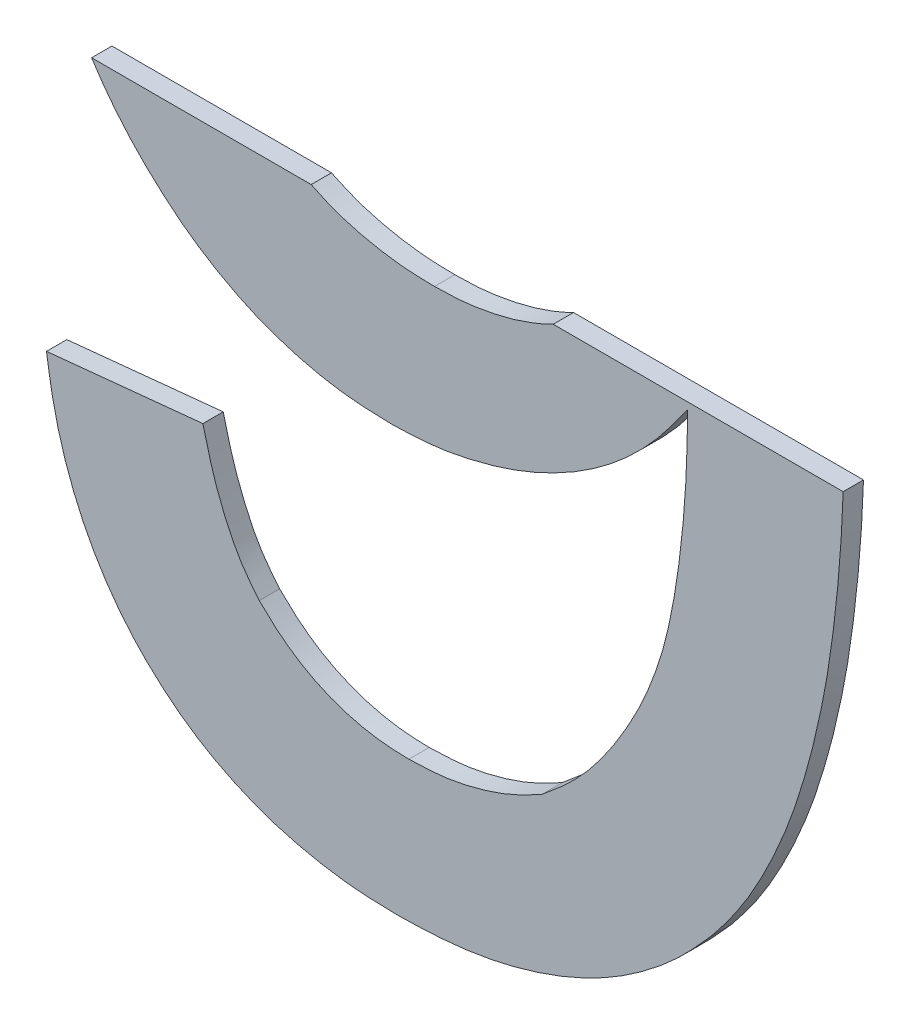
ISO-10303-21;
HEADER;
FILE_DESCRIPTION(('STEP AP214'),'2;1');
FILE_NAME('part.step','',(''),(''),'','','');
FILE_SCHEMA(('AUTOMOTIVE_DESIGN { 1 0 10303 214 1 1 1 1 }'));
ENDSEC;
DATA;
#1=APPLICATION_CONTEXT('core data for automotive mechanical design processes');
#2=APPLICATION_PROTOCOL_DEFINITION('international standard','automotive_design',2000,#1);
#3=PRODUCT_CONTEXT('',#1,'mechanical');
#4=PRODUCT('Part','Part','',(#3));
#5=PRODUCT_RELATED_PRODUCT_CATEGORY('part','',(#4));
#6=PRODUCT_DEFINITION_FORMATION('','',#4);
#7=PRODUCT_DEFINITION_CONTEXT('part definition',#1,'design');
#8=PRODUCT_DEFINITION('design','',#6,#7);
#9=PRODUCT_DEFINITION_SHAPE('','',#8);
#10=(LENGTH_UNIT() NAMED_UNIT(*) SI_UNIT(.MILLI.,.METRE.));
#11=(NAMED_UNIT(*) PLANE_ANGLE_UNIT() SI_UNIT($,.RADIAN.));
#12=(NAMED_UNIT(*) SI_UNIT($,.STERADIAN.) SOLID_ANGLE_UNIT());
#13=UNCERTAINTY_MEASURE_WITH_UNIT(LENGTH_MEASURE(1.E-05),#10,'distance_accuracy_value','');
#14=(GEOMETRIC_REPRESENTATION_CONTEXT(3) GLOBAL_UNCERTAINTY_ASSIGNED_CONTEXT((#13)) GLOBAL_UNIT_ASSIGNED_CONTEXT((#10,
#11,#12)) REPRESENTATION_CONTEXT('',''));
#15=CARTESIAN_POINT('',(0.,0.,0.));
#16=DIRECTION('',(0.,0.,1.));
#17=DIRECTION('',(1.,0.,0.));
#18=AXIS2_PLACEMENT_3D('',#15,#16,#17);
#19=CARTESIAN_POINT('',(6.53846153846051,-0.66105769230769,0.5));
#20=CARTESIAN_POINT('',(6.31163091214394,-0.97955265413839,0.5));
#21=CARTESIAN_POINT('',(5.86759612348959,-1.60302597147871,0.5));
#22=CARTESIAN_POINT('',(5.08450026442372,-2.42121954868309,0.5));
#23=CARTESIAN_POINT('',(4.22420168369231,-3.10691477412572,0.5));
#24=CARTESIAN_POINT('',(3.29574981173123,-3.65898288511663,0.5));
#25=CARTESIAN_POINT('',(2.32171004358858,-4.0870100622762,0.5));
#26=CARTESIAN_POINT('',(1.3173782510081,-4.3842189265121,0.5));
#27=CARTESIAN_POINT('',(0.292336320810029,-4.58384585004598,0.5));
#28=CARTESIAN_POINT('',(-0.401706530398715,-4.60482184661097,0.5));
#29=CARTESIAN_POINT('',(-0.751201923077954,-4.61538461538461,0.5));
#30=B_SPLINE_CURVE_WITH_KNOTS('',3,(#19,#20,#21,#22,#23,#24,#25,#26,#27,#28,#29),.UNSPECIFIED.,
.F.,.F.,(4,1,1,1,1,1,1,1,4),(0.,0.135516809987238,0.265282422655817,0.391399589415771,
0.516066609454906,0.638987766132838,0.759470315827824,0.878877772064992,1.),.UNSPECIFIED.);
#31=DIRECTION('',(0.,0.,1.));
#32=VECTOR('',#31,1.);
#33=SURFACE_OF_LINEAR_EXTRUSION('',#30,#32);
#34=CARTESIAN_POINT('',(6.53846153846051,-0.66105769230769,1.));
#35=CARTESIAN_POINT('',(6.31163091214394,-0.97955265413839,1.));
#36=CARTESIAN_POINT('',(5.86759612348959,-1.60302597147871,1.));
#37=CARTESIAN_POINT('',(5.08450026442372,-2.42121954868309,1.));
#38=CARTESIAN_POINT('',(4.22420168369231,-3.10691477412572,1.));
#39=CARTESIAN_POINT('',(3.29574981173123,-3.65898288511663,1.));
#40=CARTESIAN_POINT('',(2.32171004358858,-4.0870100622762,1.));
#41=CARTESIAN_POINT('',(1.3173782510081,-4.3842189265121,1.));
#42=CARTESIAN_POINT('',(0.292336320810029,-4.58384585004598,1.));
#43=CARTESIAN_POINT('',(-0.401706530398715,-4.60482184661097,1.));
#44=CARTESIAN_POINT('',(-0.751201923077954,-4.61538461538461,1.));
#45=B_SPLINE_CURVE_WITH_KNOTS('',3,(#34,#35,#36,#37,#38,#39,#40,#41,#42,#43,#44),.UNSPECIFIED.,
.F.,.F.,(4,1,1,1,1,1,1,1,4),(0.,0.135516809987238,0.265282422655817,0.391399589415771,
0.516066609454906,0.638987766132838,0.759470315827824,0.878877772064992,1.),.UNSPECIFIED.);
#46=CARTESIAN_POINT('',(6.53846153846051,-0.66105769230769,1.));
#47=VERTEX_POINT('',#46);
#48=CARTESIAN_POINT('',(-0.751201923077954,-4.61538461538461,1.));
#49=VERTEX_POINT('',#48);
#50=EDGE_CURVE('E167',#47,#49,#45,.T.);
#51=ORIENTED_EDGE('',*,*,#50,.T.);
#52=DIRECTION('',(0.,0.,1.));
#53=VECTOR('',#52,1.);
#54=CARTESIAN_POINT('',(-0.751201923077954,-4.61538461538461,0.5));
#55=LINE('',#54,#53);
#56=CARTESIAN_POINT('',(-0.751201923077954,-4.61538461538461,0.5));
#57=VERTEX_POINT('',#56);
#58=EDGE_CURVE('E188',#57,#49,#55,.T.);
#59=ORIENTED_EDGE('',*,*,#58,.F.);
#60=CARTESIAN_POINT('',(6.53846153846051,-0.66105769230769,0.5));
#61=VERTEX_POINT('',#60);
#62=EDGE_CURVE('E333',#61,#57,#30,.T.);
#63=ORIENTED_EDGE('',*,*,#62,.F.);
#64=DIRECTION('',(0.,0.,1.));
#65=VECTOR('',#64,1.);
#66=CARTESIAN_POINT('',(6.53846153846051,-0.66105769230769,0.5));
#67=LINE('',#66,#65);
#68=EDGE_CURVE('E195',#61,#47,#67,.T.);
#69=ORIENTED_EDGE('',*,*,#68,.T.);
#70=EDGE_LOOP('',(#51,#59,#63,#69));
#71=FACE_BOUND('',#70,.T.);
#72=ADVANCED_FACE('F39',(#71),#33,.F.);
#73=CARTESIAN_POINT('',(2.95673076922974,-10.6490384615385,0.5));
#74=CARTESIAN_POINT('',(3.20735992951563,-10.4413061263277,0.5));
#75=CARTESIAN_POINT('',(3.72184162918484,-10.0148813448952,0.5));
#76=CARTESIAN_POINT('',(4.39249755501642,-9.22972979294057,0.5));
#77=CARTESIAN_POINT('',(4.98820577540149,-8.31286480239105,0.5));
#78=CARTESIAN_POINT('',(5.43426662800634,-7.45882466601632,0.5));
#79=CARTESIAN_POINT('',(5.73982836033795,-6.68613061076901,0.5));
#80=CARTESIAN_POINT('',(5.95266811901484,-6.02918806484579,0.5));
#81=CARTESIAN_POINT('',(6.12188508160401,-5.30060906620812,0.5));
#82=CARTESIAN_POINT('',(6.26632436336191,-4.5063738217167,0.5));
#83=CARTESIAN_POINT('',(6.37701921432723,-3.64350649634124,0.5));
#84=CARTESIAN_POINT('',(6.46986063325067,-2.71198163024061,0.5));
#85=CARTESIAN_POINT('',(6.52113787483369,-1.70928117381351,0.5));
#86=CARTESIAN_POINT('',(6.5325677858346,-1.01767797943346,0.5));
#87=CARTESIAN_POINT('',(6.53846153846051,-0.66105769230769,0.5));
#88=B_SPLINE_CURVE_WITH_KNOTS('',3,(#73,#74,#75,#76,#77,#78,#79,#80,#81,#82,#83,#84,#85,#86,
#87),.UNSPECIFIED.,.F.,.F.,(4,1,1,1,1,1,1,1,1,1,1,1,4),(0.,0.0886163801948548,0.181908225879124,
0.280054048689476,0.386296180951614,0.443895035422717,0.506412148977141,0.574360256909749,
0.647625853265948,0.726402932826011,0.811442238943392,0.902771526455893,1.),.UNSPECIFIED.);
#89=DIRECTION('',(0.,0.,1.));
#90=VECTOR('',#89,1.);
#91=SURFACE_OF_LINEAR_EXTRUSION('',#88,#90);
#92=CARTESIAN_POINT('',(2.95673076922974,-10.6490384615385,1.));
#93=CARTESIAN_POINT('',(3.20735992951563,-10.4413061263277,1.));
#94=CARTESIAN_POINT('',(3.72184162918484,-10.0148813448952,1.));
#95=CARTESIAN_POINT('',(4.39249755501642,-9.22972979294057,1.));
#96=CARTESIAN_POINT('',(4.98820577540149,-8.31286480239105,1.));
#97=CARTESIAN_POINT('',(5.43426662800634,-7.45882466601632,1.));
#98=CARTESIAN_POINT('',(5.73982836033795,-6.68613061076901,1.));
#99=CARTESIAN_POINT('',(5.95266811901484,-6.02918806484579,1.));
#100=CARTESIAN_POINT('',(6.12188508160401,-5.30060906620812,1.));
#101=CARTESIAN_POINT('',(6.26632436336191,-4.5063738217167,1.));
#102=CARTESIAN_POINT('',(6.37701921432723,-3.64350649634124,1.));
#103=CARTESIAN_POINT('',(6.46986063325067,-2.71198163024061,1.));
#104=CARTESIAN_POINT('',(6.52113787483369,-1.70928117381351,1.));
#105=CARTESIAN_POINT('',(6.5325677858346,-1.01767797943346,1.));
#106=CARTESIAN_POINT('',(6.53846153846051,-0.66105769230769,1.));
#107=B_SPLINE_CURVE_WITH_KNOTS('',3,(#92,#93,#94,#95,#96,#97,#98,#99,#100,#101,#102,#103,#104,
#105,#106),.UNSPECIFIED.,.F.,.F.,(4,1,1,1,1,1,1,1,1,1,1,1,4),(0.,0.0886163801948548,
0.181908225879124,0.280054048689476,0.386296180951614,0.443895035422717,0.506412148977141,
0.574360256909749,0.647625853265948,0.726402932826011,0.811442238943392,0.902771526455893,1.),.UNSPECIFIED.);
#108=CARTESIAN_POINT('',(2.95673076922974,-10.6490384615385,1.));
#109=VERTEX_POINT('',#108);
#110=EDGE_CURVE('E251',#109,#47,#107,.T.);
#111=ORIENTED_EDGE('',*,*,#110,.T.);
#112=ORIENTED_EDGE('',*,*,#68,.F.);
#113=CARTESIAN_POINT('',(2.95673076922974,-10.6490384615385,0.5));
#114=VERTEX_POINT('',#113);
#115=EDGE_CURVE('E345',#114,#61,#88,.T.);
#116=ORIENTED_EDGE('',*,*,#115,.F.);
#117=DIRECTION('',(0.,0.,1.));
#118=VECTOR('',#117,1.);
#119=CARTESIAN_POINT('',(2.95673076922974,-10.6490384615385,0.5));
#120=LINE('',#119,#118);
#121=EDGE_CURVE('E193',#114,#109,#120,.T.);
#122=ORIENTED_EDGE('',*,*,#121,.T.);
#123=EDGE_LOOP('',(#111,#112,#116,#122));
#124=FACE_BOUND('',#123,.T.);
#125=ADVANCED_FACE('F351',(#124),#91,.F.);
#126=CARTESIAN_POINT('',(-0.318509615385647,-11.5384615384615,0.5));
#127=CARTESIAN_POINT('',(-0.0290771717076736,-11.529142172853,0.5));
#128=CARTESIAN_POINT('',(0.542828696696787,-11.5107275134126,0.5));
#129=CARTESIAN_POINT('',(1.38191682022456,-11.3304493942409,0.5));
#130=CARTESIAN_POINT('',(2.19690725302153,-11.0606344287541,0.5));
#131=CARTESIAN_POINT('',(2.7018239516796,-10.7871213398402,0.5));
#132=CARTESIAN_POINT('',(2.95673076922974,-10.6490384615385,0.5));
#133=B_SPLINE_CURVE_WITH_KNOTS('',3,(#126,#127,#128,#129,#130,#131,#132),.UNSPECIFIED.,.F.,.F.,
(4,1,1,1,4),(0.,0.252584220694484,0.499095389051355,0.747118681928214,1.),.UNSPECIFIED.);
#134=DIRECTION('',(0.,0.,1.));
#135=VECTOR('',#134,1.);
#136=SURFACE_OF_LINEAR_EXTRUSION('',#133,#135);
#137=CARTESIAN_POINT('',(-0.318509615385647,-11.5384615384615,1.));
#138=CARTESIAN_POINT('',(-0.0290771717076736,-11.529142172853,1.));
#139=CARTESIAN_POINT('',(0.542828696696787,-11.5107275134126,1.));
#140=CARTESIAN_POINT('',(1.38191682022456,-11.3304493942409,1.));
#141=CARTESIAN_POINT('',(2.19690725302153,-11.0606344287541,1.));
#142=CARTESIAN_POINT('',(2.7018239516796,-10.7871213398402,1.));
#143=CARTESIAN_POINT('',(2.95673076922974,-10.6490384615385,1.));
#144=B_SPLINE_CURVE_WITH_KNOTS('',3,(#137,#138,#139,#140,#141,#142,#143),.UNSPECIFIED.,.F.,.F.,
(4,1,1,1,4),(0.,0.252584220694484,0.499095389051355,0.747118681928214,1.),.UNSPECIFIED.);
#145=CARTESIAN_POINT('',(-0.318509615385647,-11.5384615384615,1.));
#146=VERTEX_POINT('',#145);
#147=EDGE_CURVE('E250',#146,#109,#144,.T.);
#148=ORIENTED_EDGE('',*,*,#147,.T.);
#149=ORIENTED_EDGE('',*,*,#121,.F.);
#150=CARTESIAN_POINT('',(-0.318509615385647,-11.5384615384615,0.5));
#151=VERTEX_POINT('',#150);
#152=EDGE_CURVE('E362',#151,#114,#133,.T.);
#153=ORIENTED_EDGE('',*,*,#152,.F.);
#154=DIRECTION('',(0.,0.,1.));
#155=VECTOR('',#154,1.);
#156=CARTESIAN_POINT('',(-0.318509615385647,-11.5384615384615,0.5));
#157=LINE('',#156,#155);
#158=EDGE_CURVE('E200',#151,#146,#157,.T.);
#159=ORIENTED_EDGE('',*,*,#158,.T.);
#160=EDGE_LOOP('',(#148,#149,#153,#159));
#161=FACE_BOUND('',#160,.T.);
#162=ADVANCED_FACE('F356',(#161),#136,.F.);
#163=CARTESIAN_POINT('',(-3.99639423077026,-10.,0.5));
#164=CARTESIAN_POINT('',(-3.87045457514882,-10.1227234834857,0.5));
#165=CARTESIAN_POINT('',(-3.62276042499572,-10.3640921675258,0.5));
#166=CARTESIAN_POINT('',(-3.2161367859447,-10.6787179764643,0.5));
#167=CARTESIAN_POINT('',(-2.78748816057609,-10.9452847394001,0.5));
#168=CARTESIAN_POINT('',(-2.33551901146463,-11.1612442342201,0.5));
#169=CARTESIAN_POINT('',(-1.86267106825691,-11.3318398379096,0.5));
#170=CARTESIAN_POINT('',(-1.36698569816033,-11.4511805472166,0.5));
#171=CARTESIAN_POINT('',(-0.8495858386909,-11.5250592164043,0.5));
#172=CARTESIAN_POINT('',(-0.49704245089554,-11.5339560560952,0.5));
#173=CARTESIAN_POINT('',(-0.318509615385647,-11.5384615384615,0.5));
#174=B_SPLINE_CURVE_WITH_KNOTS('',3,(#163,#164,#165,#166,#167,#168,#169,#170,#171,#172,#173),
.UNSPECIFIED.,.F.,.F.,(4,1,1,1,1,1,1,1,4),(0.,0.128545117434415,0.252818490428108,
0.375211726407749,0.497112785956316,0.618546198299019,0.742222078876612,0.869457704262154,1.),.UNSPECIFIED.);
#175=DIRECTION('',(0.,0.,1.));
#176=VECTOR('',#175,1.);
#177=SURFACE_OF_LINEAR_EXTRUSION('',#174,#176);
#178=CARTESIAN_POINT('',(-3.99639423077026,-10.,1.));
#179=CARTESIAN_POINT('',(-3.87045457514882,-10.1227234834857,1.));
#180=CARTESIAN_POINT('',(-3.62276042499572,-10.3640921675258,1.));
#181=CARTESIAN_POINT('',(-3.2161367859447,-10.6787179764643,1.));
#182=CARTESIAN_POINT('',(-2.78748816057609,-10.9452847394001,1.));
#183=CARTESIAN_POINT('',(-2.33551901146463,-11.1612442342201,1.));
#184=CARTESIAN_POINT('',(-1.86267106825691,-11.3318398379096,1.));
#185=CARTESIAN_POINT('',(-1.36698569816033,-11.4511805472166,1.));
#186=CARTESIAN_POINT('',(-0.8495858386909,-11.5250592164043,1.));
#187=CARTESIAN_POINT('',(-0.49704245089554,-11.5339560560952,1.));
#188=CARTESIAN_POINT('',(-0.318509615385647,-11.5384615384615,1.));
#189=B_SPLINE_CURVE_WITH_KNOTS('',3,(#178,#179,#180,#181,#182,#183,#184,#185,#186,#187,#188),
.UNSPECIFIED.,.F.,.F.,(4,1,1,1,1,1,1,1,4),(0.,0.128545117434415,0.252818490428108,
0.375211726407749,0.497112785956316,0.618546198299019,0.742222078876612,0.869457704262154,1.),.UNSPECIFIED.);
#190=CARTESIAN_POINT('',(-3.99639423077026,-10.,1.));
#191=VERTEX_POINT('',#190);
#192=EDGE_CURVE('E238',#191,#146,#189,.T.);
#193=ORIENTED_EDGE('',*,*,#192,.T.);
#194=ORIENTED_EDGE('',*,*,#158,.F.);
#195=CARTESIAN_POINT('',(-3.99639423077026,-10.,0.5));
#196=VERTEX_POINT('',#195);
#197=EDGE_CURVE('E367',#196,#151,#174,.T.);
#198=ORIENTED_EDGE('',*,*,#197,.F.);
#199=DIRECTION('',(0.,0.,1.));
#200=VECTOR('',#199,1.);
#201=CARTESIAN_POINT('',(-3.99639423077026,-10.,0.5));
#202=LINE('',#201,#200);
#203=EDGE_CURVE('E202',#196,#191,#202,.T.);
#204=ORIENTED_EDGE('',*,*,#203,.T.);
#205=EDGE_LOOP('',(#193,#194,#198,#204));
#206=FACE_BOUND('',#205,.T.);
#207=ADVANCED_FACE('F359',(#206),#177,.F.);
#208=CARTESIAN_POINT('',(-5.38461538461642,-6.92307692307692,0.5));
#209=CARTESIAN_POINT('',(-5.30161847905064,-7.25386667376938,0.5));
#210=CARTESIAN_POINT('',(-5.14538957808154,-7.87652746877423,0.5));
#211=CARTESIAN_POINT('',(-4.81777903363491,-8.72107290487738,0.5));
#212=CARTESIAN_POINT('',(-4.45675920186263,-9.43541469919825,0.5));
#213=CARTESIAN_POINT('',(-4.14311143455542,-9.82006802899169,0.5));
#214=CARTESIAN_POINT('',(-3.99639423077026,-10.,0.5));
#215=B_SPLINE_CURVE_WITH_KNOTS('',3,(#208,#209,#210,#211,#212,#213,#214),.UNSPECIFIED.,.F.,.F.,
(4,1,1,1,4),(0.,0.299801780518678,0.56433071040096,0.796203937640572,1.),.UNSPECIFIED.);
#216=DIRECTION('',(0.,0.,1.));
#217=VECTOR('',#216,1.);
#218=SURFACE_OF_LINEAR_EXTRUSION('',#215,#217);
#219=CARTESIAN_POINT('',(-5.38461538461642,-6.92307692307692,1.));
#220=CARTESIAN_POINT('',(-5.30161847905064,-7.25386667376938,1.));
#221=CARTESIAN_POINT('',(-5.14538957808154,-7.87652746877423,1.));
#222=CARTESIAN_POINT('',(-4.81777903363491,-8.72107290487738,1.));
#223=CARTESIAN_POINT('',(-4.45675920186263,-9.43541469919825,1.));
#224=CARTESIAN_POINT('',(-4.14311143455542,-9.82006802899169,1.));
#225=CARTESIAN_POINT('',(-3.99639423077026,-10.,1.));
#226=B_SPLINE_CURVE_WITH_KNOTS('',3,(#219,#220,#221,#222,#223,#224,#225),.UNSPECIFIED.,.F.,.F.,
(4,1,1,1,4),(0.,0.299801780518678,0.56433071040096,0.796203937640572,1.),.UNSPECIFIED.);
#227=CARTESIAN_POINT('',(-5.38461538461642,-6.92307692307692,1.));
#228=VERTEX_POINT('',#227);
#229=EDGE_CURVE('E221',#228,#191,#226,.T.);
#230=ORIENTED_EDGE('',*,*,#229,.T.);
#231=ORIENTED_EDGE('',*,*,#203,.F.);
#232=CARTESIAN_POINT('',(-5.38461538461642,-6.92307692307692,0.5));
#233=VERTEX_POINT('',#232);
#234=EDGE_CURVE('E377',#233,#196,#215,.T.);
#235=ORIENTED_EDGE('',*,*,#234,.F.);
#236=DIRECTION('',(0.,0.,1.));
#237=VECTOR('',#236,1.);
#238=CARTESIAN_POINT('',(-5.38461538461642,-6.92307692307692,0.5));
#239=LINE('',#238,#237);
#240=EDGE_CURVE('E204',#233,#228,#239,.T.);
#241=ORIENTED_EDGE('',*,*,#240,.T.);
#242=EDGE_LOOP('',(#230,#231,#235,#241));
#243=FACE_BOUND('',#242,.T.);
#244=ADVANCED_FACE('F389',(#243),#218,.F.);
#245=CARTESIAN_POINT('',(-9.23076923077026,-7.3076923076923,0.5));
#246=DIRECTION('',(0.0995037190209984,-0.995037190209989,0.));
#247=DIRECTION('',(0.995037190209989,0.0995037190209984,0.));
#248=AXIS2_PLACEMENT_3D('',#245,#246,#247);
#249=PLANE('',#248);
#250=DIRECTION('',(0.995037190209989,0.0995037190209984,0.));
#251=VECTOR('',#250,1.);
#252=CARTESIAN_POINT('',(-9.23076923077026,-7.3076923076923,1.));
#253=LINE('',#252,#251);
#254=CARTESIAN_POINT('',(-9.23076923077026,-7.3076923076923,1.));
#255=VERTEX_POINT('',#254);
#256=EDGE_CURVE('E212',#255,#228,#253,.T.);
#257=ORIENTED_EDGE('',*,*,#256,.T.);
#258=ORIENTED_EDGE('',*,*,#240,.F.);
#259=DIRECTION('',(0.995037190209989,0.0995037190209984,0.));
#260=VECTOR('',#259,1.);
#261=CARTESIAN_POINT('',(-9.23076923077026,-7.3076923076923,0.5));
#262=LINE('',#261,#260);
#263=CARTESIAN_POINT('',(-9.23076923077026,-7.3076923076923,0.5));
#264=VERTEX_POINT('',#263);
#265=EDGE_CURVE('E211',#264,#233,#262,.T.);
#266=ORIENTED_EDGE('',*,*,#265,.F.);
#267=DIRECTION('',(0.,0.,1.));
#268=VECTOR('',#267,1.);
#269=CARTESIAN_POINT('',(-9.23076923077026,-7.3076923076923,0.5));
#270=LINE('',#269,#268);
#271=EDGE_CURVE('E48',#264,#255,#270,.T.);
#272=ORIENTED_EDGE('',*,*,#271,.T.);
#273=EDGE_LOOP('',(#257,#258,#266,#272));
#274=FACE_BOUND('',#273,.T.);
#275=ADVANCED_FACE('F208',(#274),#249,.F.);
#276=CARTESIAN_POINT('',(-0.570913461539493,-15.,0.5));
#277=CARTESIAN_POINT('',(-0.863638272127849,-14.9948255298946,0.5));
#278=CARTESIAN_POINT('',(-1.43871974066911,-14.984659866584,0.5));
#279=CARTESIAN_POINT('',(-2.28136087150356,-14.8871192884914,0.5));
#280=CARTESIAN_POINT('',(-3.08286066139873,-14.7240948497668,0.5));
#281=CARTESIAN_POINT('',(-3.84500425656874,-14.5041931041465,0.5));
#282=CARTESIAN_POINT('',(-4.56335999856933,-14.2114757954236,0.5));
#283=CARTESIAN_POINT('',(-5.2462096620458,-13.8645741042951,0.5));
#284=CARTESIAN_POINT('',(-5.88661945747588,-13.4472731717489,0.5));
#285=CARTESIAN_POINT('',(-6.47995315600206,-12.9652742506885,0.5));
#286=CARTESIAN_POINT('',(-7.02768042096374,-12.4322407062634,0.5));
#287=CARTESIAN_POINT('',(-7.51827211299423,-11.8436963818343,0.5));
#288=CARTESIAN_POINT('',(-7.94987972026282,-11.2069765653888,0.5));
#289=CARTESIAN_POINT('',(-8.32587845243072,-10.5207570251502,0.5));
#290=CARTESIAN_POINT('',(-8.64290843890195,-9.78828608900874,0.5));
#291=CARTESIAN_POINT('',(-8.90320581129529,-9.00641569101891,0.5));
#292=CARTESIAN_POINT('',(-9.10104918384394,-8.17534675534615,0.5));
#293=CARTESIAN_POINT('',(-9.18692984844009,-7.60091942225517,0.5));
#294=CARTESIAN_POINT('',(-9.23076923077026,-7.3076923076923,0.5));
#295=B_SPLINE_CURVE_WITH_KNOTS('',3,(#276,#277,#278,#279,#280,#281,#282,#283,#284,#285,#286,
#287,#288,#289,#290,#291,#292,#293,#294),.UNSPECIFIED.,.F.,.F.,(4,1,1,1,1,1,1,1,1,1,1,1,1,1,1,1,
4),(0.,0.0684992740155346,0.134572341222761,0.198207893865756,0.259783711188208,
0.319950862989212,0.37950832092492,0.438814215083894,0.498497057280356,0.558181741397725,
0.617437565688256,0.677522440710481,0.737959401720465,0.800329915923327,0.864089729907005,
0.930622075164175,1.),.UNSPECIFIED.);
#296=DIRECTION('',(0.,0.,1.));
#297=VECTOR('',#296,1.);
#298=SURFACE_OF_LINEAR_EXTRUSION('',#295,#297);
#299=CARTESIAN_POINT('',(-0.570913461539493,-15.,1.));
#300=CARTESIAN_POINT('',(-0.863638272127849,-14.9948255298946,1.));
#301=CARTESIAN_POINT('',(-1.43871974066911,-14.984659866584,1.));
#302=CARTESIAN_POINT('',(-2.28136087150356,-14.8871192884914,1.));
#303=CARTESIAN_POINT('',(-3.08286066139873,-14.7240948497668,1.));
#304=CARTESIAN_POINT('',(-3.84500425656874,-14.5041931041465,1.));
#305=CARTESIAN_POINT('',(-4.56335999856933,-14.2114757954236,1.));
#306=CARTESIAN_POINT('',(-5.2462096620458,-13.8645741042951,1.));
#307=CARTESIAN_POINT('',(-5.88661945747588,-13.4472731717489,1.));
#308=CARTESIAN_POINT('',(-6.47995315600206,-12.9652742506885,1.));
#309=CARTESIAN_POINT('',(-7.02768042096374,-12.4322407062634,1.));
#310=CARTESIAN_POINT('',(-7.51827211299423,-11.8436963818343,1.));
#311=CARTESIAN_POINT('',(-7.94987972026282,-11.2069765653888,1.));
#312=CARTESIAN_POINT('',(-8.32587845243072,-10.5207570251502,1.));
#313=CARTESIAN_POINT('',(-8.64290843890195,-9.78828608900874,1.));
#314=CARTESIAN_POINT('',(-8.90320581129529,-9.00641569101891,1.));
#315=CARTESIAN_POINT('',(-9.10104918384394,-8.17534675534615,1.));
#316=CARTESIAN_POINT('',(-9.18692984844009,-7.60091942225517,1.));
#317=CARTESIAN_POINT('',(-9.23076923077026,-7.3076923076923,1.));
#318=B_SPLINE_CURVE_WITH_KNOTS('',3,(#299,#300,#301,#302,#303,#304,#305,#306,#307,#308,#309,
#310,#311,#312,#313,#314,#315,#316,#317),.UNSPECIFIED.,.F.,.F.,(4,1,1,1,1,1,1,1,1,1,1,1,1,1,1,1,
4),(0.,0.0684992740155346,0.134572341222761,0.198207893865756,0.259783711188208,
0.319950862989212,0.37950832092492,0.438814215083894,0.498497057280356,0.558181741397725,
0.617437565688256,0.677522440710481,0.737959401720465,0.800329915923327,0.864089729907005,
0.930622075164175,1.),.UNSPECIFIED.);
#319=CARTESIAN_POINT('',(-0.570913461539493,-15.,1.));
#320=VERTEX_POINT('',#319);
#321=EDGE_CURVE('E220',#320,#255,#318,.T.);
#322=ORIENTED_EDGE('',*,*,#321,.T.);
#323=ORIENTED_EDGE('',*,*,#271,.F.);
#324=CARTESIAN_POINT('',(-0.570913461539493,-15.,0.5));
#325=VERTEX_POINT('',#324);
#326=EDGE_CURVE('E161',#325,#264,#295,.T.);
#327=ORIENTED_EDGE('',*,*,#326,.F.);
#328=DIRECTION('',(0.,0.,1.));
#329=VECTOR('',#328,1.);
#330=CARTESIAN_POINT('',(-0.570913461539493,-15.,0.5));
#331=LINE('',#330,#329);
#332=EDGE_CURVE('E179',#325,#320,#331,.T.);
#333=ORIENTED_EDGE('',*,*,#332,.T.);
#334=EDGE_LOOP('',(#322,#323,#327,#333));
#335=FACE_BOUND('',#334,.T.);
#336=ADVANCED_FACE('F41',(#335),#298,.F.);
#337=CARTESIAN_POINT('',(7.11538461538358,-11.5925480769231,0.5));
#338=CARTESIAN_POINT('',(6.87310963754878,-11.8650597026479,0.5));
#339=CARTESIAN_POINT('',(6.39556316121449,-12.40220541942,0.5));
#340=CARTESIAN_POINT('',(5.57863128491739,-13.0960704501937,0.5));
#341=CARTESIAN_POINT('',(4.70812155342361,-13.6887379356287,0.5));
#342=CARTESIAN_POINT('',(3.77015038620344,-14.1675619603598,0.5));
#343=CARTESIAN_POINT('',(2.77188675836666,-14.5408685372559,0.5));
#344=CARTESIAN_POINT('',(1.71270484472725,-14.8118560341525,0.5));
#345=CARTESIAN_POINT('',(0.589649028375766,-14.9690100758799,0.5));
#346=CARTESIAN_POINT('',(-0.177788997537032,-14.989502592566,0.5));
#347=CARTESIAN_POINT('',(-0.570913461539493,-15.,0.5));
#348=B_SPLINE_CURVE_WITH_KNOTS('',3,(#337,#338,#339,#340,#341,#342,#343,#344,#345,#346,#347),
.UNSPECIFIED.,.F.,.F.,(4,1,1,1,1,1,1,1,4),(0.,0.125625294607653,0.247619119871497,
0.368528289523357,0.488103730023934,0.609878261488192,0.735381918213606,0.864447892787298,1.),.UNSPECIFIED.);
#349=DIRECTION('',(0.,0.,1.));
#350=VECTOR('',#349,1.);
#351=SURFACE_OF_LINEAR_EXTRUSION('',#348,#350);
#352=CARTESIAN_POINT('',(7.11538461538358,-11.5925480769231,1.));
#353=CARTESIAN_POINT('',(6.87310963754878,-11.8650597026479,1.));
#354=CARTESIAN_POINT('',(6.39556316121449,-12.40220541942,1.));
#355=CARTESIAN_POINT('',(5.57863128491739,-13.0960704501937,1.));
#356=CARTESIAN_POINT('',(4.70812155342361,-13.6887379356287,1.));
#357=CARTESIAN_POINT('',(3.77015038620344,-14.1675619603598,1.));
#358=CARTESIAN_POINT('',(2.77188675836666,-14.5408685372559,1.));
#359=CARTESIAN_POINT('',(1.71270484472725,-14.8118560341525,1.));
#360=CARTESIAN_POINT('',(0.589649028375766,-14.9690100758799,1.));
#361=CARTESIAN_POINT('',(-0.177788997537032,-14.989502592566,1.));
#362=CARTESIAN_POINT('',(-0.570913461539493,-15.,1.));
#363=B_SPLINE_CURVE_WITH_KNOTS('',3,(#352,#353,#354,#355,#356,#357,#358,#359,#360,#361,#362),
.UNSPECIFIED.,.F.,.F.,(4,1,1,1,1,1,1,1,4),(0.,0.125625294607653,0.247619119871497,
0.368528289523357,0.488103730023934,0.609878261488192,0.735381918213606,0.864447892787298,1.),.UNSPECIFIED.);
#364=CARTESIAN_POINT('',(7.11538461538358,-11.5925480769231,1.));
#365=VERTEX_POINT('',#364);
#366=EDGE_CURVE('E162',#365,#320,#363,.T.);
#367=ORIENTED_EDGE('',*,*,#366,.T.);
#368=ORIENTED_EDGE('',*,*,#332,.F.);
#369=CARTESIAN_POINT('',(7.11538461538358,-11.5925480769231,0.5));
#370=VERTEX_POINT('',#369);
#371=EDGE_CURVE('E190',#370,#325,#348,.T.);
#372=ORIENTED_EDGE('',*,*,#371,.F.);
#373=DIRECTION('',(0.,0.,1.));
#374=VECTOR('',#373,1.);
#375=CARTESIAN_POINT('',(7.11538461538358,-11.5925480769231,0.5));
#376=LINE('',#375,#374);
#377=EDGE_CURVE('E186',#370,#365,#376,.T.);
#378=ORIENTED_EDGE('',*,*,#377,.T.);
#379=EDGE_LOOP('',(#367,#368,#372,#378));
#380=FACE_BOUND('',#379,.T.);
#381=ADVANCED_FACE('F320',(#380),#351,.F.);
#382=CARTESIAN_POINT('',(-5.7692307692318,5.24038461538462,0.5));
#383=CARTESIAN_POINT('',(-5.76548307373506,4.99973713439808,0.5));
#384=CARTESIAN_POINT('',(-5.75815398225845,4.52912061731443,0.5));
#385=CARTESIAN_POINT('',(-5.67552539760989,3.84241663759643,0.5));
#386=CARTESIAN_POINT('',(-5.5554688604917,3.19314256278714,0.5));
#387=CARTESIAN_POINT('',(-5.36950630431968,2.58541542280608,0.5));
#388=CARTESIAN_POINT('',(-5.14577017622396,2.01570219900155,0.5));
#389=CARTESIAN_POINT('',(-4.86555757943166,1.4856655008551,0.5));
#390=CARTESIAN_POINT('',(-4.53315107267625,0.995798413937766,0.5));
#391=CARTESIAN_POINT('',(-4.14927139890401,0.547436953164797,0.5));
#392=CARTESIAN_POINT('',(-3.72466431145334,0.143143069699446,0.5));
#393=CARTESIAN_POINT('',(-3.25437334938629,-0.202549579727878,0.5));
#394=CARTESIAN_POINT('',(-2.75047616777466,-0.496086072099565,0.5));
#395=CARTESIAN_POINT('',(-2.20943647475685,-0.740076475908066,0.5));
#396=CARTESIAN_POINT('',(-1.63050325211195,-0.925636184295898,0.5));
#397=CARTESIAN_POINT('',(-1.01400141902093,-1.05446425752607,0.5));
#398=CARTESIAN_POINT('',(-0.363202494056235,-1.14432663576168,0.5));
#399=CARTESIAN_POINT('',(0.0838132339980732,-1.15062433977298,0.5));
#400=CARTESIAN_POINT('',(0.312499999998968,-1.15384615384615,0.5));
#401=B_SPLINE_CURVE_WITH_KNOTS('',3,(#382,#383,#384,#385,#386,#387,#388,#389,#390,#391,#392,
#393,#394,#395,#396,#397,#398,#399,#400),.UNSPECIFIED.,.F.,.F.,(4,1,1,1,1,1,1,1,1,1,1,1,1,1,1,1,
4),(0.,0.0722026535685907,0.141201400518914,0.207364092776097,0.270147375692274,
0.331676873716226,0.390857640059306,0.449735156775021,0.50902581116344,0.567731099086861,
0.62534201751626,0.683822031340533,0.742499592485817,0.80316493575478,0.865913649548624,
0.931403366984299,1.),.UNSPECIFIED.);
#402=DIRECTION('',(0.,0.,1.));
#403=VECTOR('',#402,1.);
#404=SURFACE_OF_LINEAR_EXTRUSION('',#401,#403);
#405=CARTESIAN_POINT('',(-2.72056331803152,-0.5,0.5));
#406=VERTEX_POINT('',#405);
#407=CARTESIAN_POINT('',(0.312499999998968,-1.15384615384615,0.5));
#408=VERTEX_POINT('',#407);
#409=EDGE_CURVE('E222',#406,#408,#401,.T.);
#410=ORIENTED_EDGE('',*,*,#409,.F.);
#411=DIRECTION('',(0.,0.,1.));
#412=VECTOR('',#411,1.);
#413=CARTESIAN_POINT('',(-2.72056331803152,-0.5,0.5));
#414=LINE('',#413,#412);
#415=CARTESIAN_POINT('',(-2.72056331803152,-0.5,1.));
#416=VERTEX_POINT('',#415);
#417=EDGE_CURVE('E11',#406,#416,#414,.T.);
#418=ORIENTED_EDGE('',*,*,#417,.T.);
#419=CARTESIAN_POINT('',(-5.7692307692318,5.24038461538462,1.));
#420=CARTESIAN_POINT('',(-5.76548307373506,4.99973713439808,1.));
#421=CARTESIAN_POINT('',(-5.75815398225845,4.52912061731443,1.));
#422=CARTESIAN_POINT('',(-5.67552539760989,3.84241663759643,1.));
#423=CARTESIAN_POINT('',(-5.5554688604917,3.19314256278714,1.));
#424=CARTESIAN_POINT('',(-5.36950630431968,2.58541542280608,1.));
#425=CARTESIAN_POINT('',(-5.14577017622396,2.01570219900155,1.));
#426=CARTESIAN_POINT('',(-4.86555757943166,1.4856655008551,1.));
#427=CARTESIAN_POINT('',(-4.53315107267625,0.995798413937766,1.));
#428=CARTESIAN_POINT('',(-4.14927139890401,0.547436953164797,1.));
#429=CARTESIAN_POINT('',(-3.72466431145334,0.143143069699446,1.));
#430=CARTESIAN_POINT('',(-3.25437334938629,-0.202549579727878,1.));
#431=CARTESIAN_POINT('',(-2.75047616777466,-0.496086072099565,1.));
#432=CARTESIAN_POINT('',(-2.20943647475685,-0.740076475908066,1.));
#433=CARTESIAN_POINT('',(-1.63050325211195,-0.925636184295898,1.));
#434=CARTESIAN_POINT('',(-1.01400141902093,-1.05446425752607,1.));
#435=CARTESIAN_POINT('',(-0.363202494056235,-1.14432663576168,1.));
#436=CARTESIAN_POINT('',(0.0838132339980732,-1.15062433977298,1.));
#437=CARTESIAN_POINT('',(0.312499999998968,-1.15384615384615,1.));
#438=B_SPLINE_CURVE_WITH_KNOTS('',3,(#419,#420,#421,#422,#423,#424,#425,#426,#427,#428,#429,
#430,#431,#432,#433,#434,#435,#436,#437),.UNSPECIFIED.,.F.,.F.,(4,1,1,1,1,1,1,1,1,1,1,1,1,1,1,1,
4),(0.,0.0722026535685907,0.141201400518914,0.207364092776097,0.270147375692274,
0.331676873716226,0.390857640059306,0.449735156775021,0.50902581116344,0.567731099086861,
0.62534201751626,0.683822031340533,0.742499592485817,0.80316493575478,0.865913649548624,
0.931403366984299,1.),.UNSPECIFIED.);
#439=CARTESIAN_POINT('',(0.312499999998968,-1.15384615384615,1.));
#440=VERTEX_POINT('',#439);
#441=EDGE_CURVE('E285',#416,#440,#438,.T.);
#442=ORIENTED_EDGE('',*,*,#441,.T.);
#443=DIRECTION('',(0.,0.,1.));
#444=VECTOR('',#443,1.);
#445=CARTESIAN_POINT('',(0.312499999998968,-1.15384615384615,0.5));
#446=LINE('',#445,#444);
#447=EDGE_CURVE('E219',#408,#440,#446,.T.);
#448=ORIENTED_EDGE('',*,*,#447,.F.);
#449=EDGE_LOOP('',(#410,#418,#442,#448));
#450=FACE_BOUND('',#449,.T.);
#451=ADVANCED_FACE('F306',(#450),#404,.F.);
#452=CARTESIAN_POINT('',(0.312499999998968,-1.15384615384615,0.5));
#453=CARTESIAN_POINT('',(0.525181620842528,-1.15052628186562,0.5));
#454=CARTESIAN_POINT('',(0.944290969526357,-1.14398415858315,0.5));
#455=CARTESIAN_POINT('',(1.5588844299818,-1.05335744478311,0.5));
#456=CARTESIAN_POINT('',(2.15135861981516,-0.924500664957569,0.5));
#457=CARTESIAN_POINT('',(2.718733505482,-0.73620035898907,0.5));
#458=CARTESIAN_POINT('',(3.26187993920729,-0.497381270453797,0.5));
#459=CARTESIAN_POINT('',(3.77444532617255,-0.195966551531512,0.5));
#460=CARTESIAN_POINT('',(4.27230429312829,0.142663492331543,0.5));
#461=CARTESIAN_POINT('',(4.72925431112438,0.548351553100205,0.5));
#462=CARTESIAN_POINT('',(5.15751420700648,0.986063218768485,0.5));
#463=CARTESIAN_POINT('',(5.52382964577388,1.4714058416857,0.5));
#464=CARTESIAN_POINT('',(5.83829932064252,1.98443429725264,0.5));
#465=CARTESIAN_POINT('',(6.10014231192552,2.52874864371323,0.5));
#466=CARTESIAN_POINT('',(6.29906273963121,3.10979085232619,0.5));
#467=CARTESIAN_POINT('',(6.43408372567645,3.7250009629822,0.5));
#468=CARTESIAN_POINT('',(6.52116993396006,4.37253099910386,0.5));
#469=CARTESIAN_POINT('',(6.53260799394678,4.81541624209692,0.5));
#470=CARTESIAN_POINT('',(6.53846153846051,5.04206730769231,0.5));
#471=B_SPLINE_CURVE_WITH_KNOTS('',3,(#452,#453,#454,#455,#456,#457,#458,#459,#460,#461,#462,
#463,#464,#465,#466,#467,#468,#469,#470),.UNSPECIFIED.,.F.,.F.,(4,1,1,1,1,1,1,1,1,1,1,1,1,1,1,1,
4),(0.,0.0648134675243328,0.127721098101111,0.189090647128161,0.249568581464557,
0.309746375316349,0.369694185537686,0.43071293525297,0.493078171473314,0.555739028721918,
0.617208872237963,0.678092868476808,0.739038153231513,0.801064241544692,0.864952355745952,
0.930887982924266,1.),.UNSPECIFIED.);
#472=DIRECTION('',(0.,0.,1.));
#473=VECTOR('',#472,1.);
#474=SURFACE_OF_LINEAR_EXTRUSION('',#471,#473);
#475=CARTESIAN_POINT('',(0.312499999998968,-1.15384615384615,1.));
#476=CARTESIAN_POINT('',(0.525181620842528,-1.15052628186562,1.));
#477=CARTESIAN_POINT('',(0.944290969526357,-1.14398415858315,1.));
#478=CARTESIAN_POINT('',(1.5588844299818,-1.05335744478311,1.));
#479=CARTESIAN_POINT('',(2.15135861981516,-0.924500664957569,1.));
#480=CARTESIAN_POINT('',(2.718733505482,-0.73620035898907,1.));
#481=CARTESIAN_POINT('',(3.26187993920729,-0.497381270453797,1.));
#482=CARTESIAN_POINT('',(3.77444532617255,-0.195966551531512,1.));
#483=CARTESIAN_POINT('',(4.27230429312829,0.142663492331543,1.));
#484=CARTESIAN_POINT('',(4.72925431112438,0.548351553100205,1.));
#485=CARTESIAN_POINT('',(5.15751420700648,0.986063218768485,1.));
#486=CARTESIAN_POINT('',(5.52382964577388,1.4714058416857,1.));
#487=CARTESIAN_POINT('',(5.83829932064252,1.98443429725264,1.));
#488=CARTESIAN_POINT('',(6.10014231192552,2.52874864371323,1.));
#489=CARTESIAN_POINT('',(6.29906273963121,3.10979085232619,1.));
#490=CARTESIAN_POINT('',(6.43408372567645,3.7250009629822,1.));
#491=CARTESIAN_POINT('',(6.52116993396006,4.37253099910386,1.));
#492=CARTESIAN_POINT('',(6.53260799394678,4.81541624209692,1.));
#493=CARTESIAN_POINT('',(6.53846153846051,5.04206730769231,1.));
#494=B_SPLINE_CURVE_WITH_KNOTS('',3,(#475,#476,#477,#478,#479,#480,#481,#482,#483,#484,#485,
#486,#487,#488,#489,#490,#491,#492,#493),.UNSPECIFIED.,.F.,.F.,(4,1,1,1,1,1,1,1,1,1,1,1,1,1,1,1,
4),(0.,0.0648134675243328,0.127721098101111,0.189090647128161,0.249568581464557,
0.309746375316349,0.369694185537686,0.43071293525297,0.493078171473314,0.555739028721918,
0.617208872237963,0.678092868476808,0.739038153231513,0.801064241544692,0.864952355745952,
0.930887982924266,1.),.UNSPECIFIED.);
#495=CARTESIAN_POINT('',(3.23119136894055,-0.5,1.));
#496=VERTEX_POINT('',#495);
#497=EDGE_CURVE('E157',#440,#496,#494,.T.);
#498=ORIENTED_EDGE('',*,*,#497,.T.);
#499=DIRECTION('',(0.,0.,1.));
#500=VECTOR('',#499,1.);
#501=CARTESIAN_POINT('',(3.23119136894055,-0.500000000000117,0.5));
#502=LINE('',#501,#500);
#503=CARTESIAN_POINT('',(3.23119136894055,-0.500000000000117,0.5));
#504=VERTEX_POINT('',#503);
#505=EDGE_CURVE('E145',#496,#504,#502,.F.);
#506=ORIENTED_EDGE('',*,*,#505,.T.);
#507=EDGE_CURVE('E286',#408,#504,#471,.T.);
#508=ORIENTED_EDGE('',*,*,#507,.F.);
#509=ORIENTED_EDGE('',*,*,#447,.T.);
#510=EDGE_LOOP('',(#498,#506,#508,#509));
#511=FACE_BOUND('',#510,.T.);
#512=ADVANCED_FACE('F301',(#511),#474,.F.);
#513=CARTESIAN_POINT('',(-6.48674058951997,-12.9439054380009,0.5));
#514=DIRECTION('',(0.,0.,1.));
#515=DIRECTION('',(0.,-1.,0.));
#516=AXIS2_PLACEMENT_3D('',#513,#514,#515);
#517=PLANE('',#516);
#518=CARTESIAN_POINT('',(-0.751201923077954,-4.61538461538461,0.5));
#519=CARTESIAN_POINT('',(-1.05208136722512,-4.6073141245753,0.5));
#520=CARTESIAN_POINT('',(-1.64652592040459,-4.59136933540342,0.5));
#521=CARTESIAN_POINT('',(-2.52174364885279,-4.46427746787016,0.5));
#522=CARTESIAN_POINT('',(-3.35965405508531,-4.24438969088594,0.5));
#523=CARTESIAN_POINT('',(-4.16805477719507,-3.95105285190533,0.5));
#524=CARTESIAN_POINT('',(-4.93626094891747,-3.56177482233258,0.5));
#525=CARTESIAN_POINT('',(-5.67726773130192,-3.09868306532259,0.5));
#526=CARTESIAN_POINT('',(-6.3747842947918,-2.53834942335426,0.5));
#527=CARTESIAN_POINT('',(-7.03748292645032,-1.90788221862828,0.5));
#528=CARTESIAN_POINT('',(-7.64393124396128,-1.20720674974773,0.5));
#529=CARTESIAN_POINT('',(-8.17223120863799,-0.449278447272658,0.5));
#530=CARTESIAN_POINT('',(-8.62332598090395,0.356403135815881,0.5));
#531=CARTESIAN_POINT('',(-8.98197896681757,1.21479841384775,0.5));
#532=CARTESIAN_POINT('',(-9.26618566707091,2.12202585891723,0.5));
#533=CARTESIAN_POINT('',(-9.46905048683924,3.07755895409878,0.5));
#534=CARTESIAN_POINT('',(-9.59116435200617,4.08337678900219,0.5));
#535=CARTESIAN_POINT('',(-9.60718732743587,4.76928467203448,0.5));
#536=CARTESIAN_POINT('',(-9.61538461538565,5.12019230769231,0.5));
#537=B_SPLINE_CURVE_WITH_KNOTS('',3,(#518,#519,#520,#521,#522,#523,#524,#525,#526,#527,#528,
#529,#530,#531,#532,#533,#534,#535,#536),.UNSPECIFIED.,.F.,.F.,(4,1,1,1,1,1,1,1,1,1,1,1,1,1,1,1,
4),(0.,0.0613500156391669,0.121208621404991,0.179871554014015,0.237779878975049,
0.296247579069997,0.355188698054684,0.415676988356908,0.478383266634535,0.54153119524827,
0.604321267255817,0.666503625249698,0.729484807150661,0.793706037151852,0.860134946175092,
0.928445617023847,1.),.UNSPECIFIED.);
#538=CARTESIAN_POINT('',(-8.12235265669691,-0.5,0.499999999999935));
#539=VERTEX_POINT('',#538);
#540=EDGE_CURVE('E279',#57,#539,#537,.T.);
#541=ORIENTED_EDGE('',*,*,#540,.T.);
#542=DIRECTION('',(1.,0.,0.));
#543=VECTOR('',#542,1.);
#544=CARTESIAN_POINT('',(-6.48674058951997,-0.5,0.499999999999935));
#545=LINE('',#544,#543);
#546=EDGE_CURVE('E150',#539,#406,#545,.T.);
#547=ORIENTED_EDGE('',*,*,#546,.T.);
#548=ORIENTED_EDGE('',*,*,#409,.T.);
#549=ORIENTED_EDGE('',*,*,#507,.T.);
#550=CARTESIAN_POINT('',(10.3623716743357,-0.5,0.499999999999933));
#551=VERTEX_POINT('',#550);
#552=EDGE_CURVE('E54',#504,#551,#545,.T.);
#553=ORIENTED_EDGE('',*,*,#552,.T.);
#554=CARTESIAN_POINT('',(10.3846153846144,0.955528846153849,0.5));
#555=CARTESIAN_POINT('',(10.3821977142446,0.602943470335046,0.5));
#556=CARTESIAN_POINT('',(10.3774297635355,-0.0923993330622184,0.5));
#557=CARTESIAN_POINT('',(10.3430890811813,-1.11663879616051,0.5));
#558=CARTESIAN_POINT('',(10.2753772341105,-2.10441400548949,0.5));
#559=CARTESIAN_POINT('',(10.1863756728686,-3.05443693995836,0.500000000000001));
#560=CARTESIAN_POINT('',(10.0717015147186,-3.9682283986958,0.5));
#561=CARTESIAN_POINT('',(9.93709266733761,-4.84519617463858,0.5));
#562=CARTESIAN_POINT('',(9.76535153213035,-5.68411287015174,0.5));
#563=CARTESIAN_POINT('',(9.57638652763083,-6.48683172140972,0.5));
#564=CARTESIAN_POINT('',(9.35717288971091,-7.25390389678419,0.5));
#565=CARTESIAN_POINT('',(9.12160097875641,-7.98629697891753,0.5));
#566=CARTESIAN_POINT('',(8.84819772702343,-8.67864494150063,0.5));
#567=CARTESIAN_POINT('',(8.55475591867709,-9.33514237132312,0.5));
#568=CARTESIAN_POINT('',(8.23544144492709,-9.95482744519534,0.5));
#569=CARTESIAN_POINT('',(7.89549902009558,-10.5400820912108,0.5));
#570=CARTESIAN_POINT('',(7.51972152317346,-11.083398874254,0.5));
#571=CARTESIAN_POINT('',(7.24946852493384,-11.4237069092656,0.5));
#572=CARTESIAN_POINT('',(7.11538461538358,-11.5925480769231,0.5));
#573=B_SPLINE_CURVE_WITH_KNOTS('',3,(#554,#555,#556,#557,#558,#559,#560,#561,#562,#563,#564,
#565,#566,#567,#568,#569,#570,#571,#572),.UNSPECIFIED.,.F.,.F.,(4,1,1,1,1,1,1,1,1,1,1,1,1,1,1,1,
4),(0.,0.0800277717235732,0.157824853088924,0.232558913600784,0.304720401798522,
0.374368665994504,0.441569713459507,0.506038880147261,0.568678357004665,0.628697033085732,
0.687072628177058,0.743220712025028,0.797557571320744,0.850225217791088,0.901379566966964,
0.951070244146251,1.),.UNSPECIFIED.);
#574=EDGE_CURVE('E153',#551,#370,#573,.T.);
#575=ORIENTED_EDGE('',*,*,#574,.T.);
#576=ORIENTED_EDGE('',*,*,#371,.T.);
#577=ORIENTED_EDGE('',*,*,#326,.T.);
#578=ORIENTED_EDGE('',*,*,#265,.T.);
#579=ORIENTED_EDGE('',*,*,#234,.T.);
#580=ORIENTED_EDGE('',*,*,#197,.T.);
#581=ORIENTED_EDGE('',*,*,#152,.T.);
#582=ORIENTED_EDGE('',*,*,#115,.T.);
#583=ORIENTED_EDGE('',*,*,#62,.T.);
#584=EDGE_LOOP('',(#541,#547,#548,#549,#553,#575,#576,#577,#578,#579,#580,#581,#582,#583));
#585=FACE_BOUND('',#584,.T.);
#586=ADVANCED_FACE('F310',(#585),#517,.F.);
#587=DIRECTION('',(0.,0.,1.));
#588=VECTOR('',#587,1.);
#589=SURFACE_OF_LINEAR_EXTRUSION('',#573,#588);
#590=ORIENTED_EDGE('',*,*,#574,.F.);
#591=DIRECTION('',(0.,0.,1.));
#592=VECTOR('',#591,1.);
#593=CARTESIAN_POINT('',(10.3623716746356,-0.5,0.5));
#594=LINE('',#593,#592);
#595=CARTESIAN_POINT('',(10.3623716743357,-0.5,1.));
#596=VERTEX_POINT('',#595);
#597=EDGE_CURVE('E141',#551,#596,#594,.T.);
#598=ORIENTED_EDGE('',*,*,#597,.T.);
#599=CARTESIAN_POINT('',(10.3846153846144,0.955528846153849,1.));
#600=CARTESIAN_POINT('',(10.3821977142446,0.602943470335046,1.));
#601=CARTESIAN_POINT('',(10.3774297635355,-0.0923993330622184,1.));
#602=CARTESIAN_POINT('',(10.3430890811813,-1.11663879616051,1.));
#603=CARTESIAN_POINT('',(10.2753772341105,-2.10441400548949,1.));
#604=CARTESIAN_POINT('',(10.1863756728686,-3.05443693995836,1.));
#605=CARTESIAN_POINT('',(10.0717015147186,-3.9682283986958,1.));
#606=CARTESIAN_POINT('',(9.93709266733761,-4.84519617463858,1.));
#607=CARTESIAN_POINT('',(9.76535153213035,-5.68411287015174,1.));
#608=CARTESIAN_POINT('',(9.57638652763083,-6.48683172140972,1.));
#609=CARTESIAN_POINT('',(9.35717288971091,-7.25390389678419,1.));
#610=CARTESIAN_POINT('',(9.12160097875641,-7.98629697891753,1.));
#611=CARTESIAN_POINT('',(8.84819772702343,-8.67864494150063,1.));
#612=CARTESIAN_POINT('',(8.55475591867709,-9.33514237132312,1.));
#613=CARTESIAN_POINT('',(8.23544144492709,-9.95482744519534,1.));
#614=CARTESIAN_POINT('',(7.89549902009558,-10.5400820912108,1.));
#615=CARTESIAN_POINT('',(7.51972152317346,-11.083398874254,1.));
#616=CARTESIAN_POINT('',(7.24946852493384,-11.4237069092656,1.));
#617=CARTESIAN_POINT('',(7.11538461538358,-11.5925480769231,1.));
#618=B_SPLINE_CURVE_WITH_KNOTS('',3,(#599,#600,#601,#602,#603,#604,#605,#606,#607,#608,#609,
#610,#611,#612,#613,#614,#615,#616,#617),.UNSPECIFIED.,.F.,.F.,(4,1,1,1,1,1,1,1,1,1,1,1,1,1,1,1,
4),(0.,0.0800277717235732,0.157824853088924,0.232558913600784,0.304720401798522,
0.374368665994504,0.441569713459507,0.506038880147261,0.568678357004665,0.628697033085732,
0.687072628177058,0.743220712025028,0.797557571320744,0.850225217791088,0.901379566966964,
0.951070244146251,1.),.UNSPECIFIED.);
#619=EDGE_CURVE('E155',#596,#365,#618,.T.);
#620=ORIENTED_EDGE('',*,*,#619,.T.);
#621=ORIENTED_EDGE('',*,*,#377,.F.);
#622=EDGE_LOOP('',(#590,#598,#620,#621));
#623=FACE_BOUND('',#622,.T.);
#624=ADVANCED_FACE('F152',(#623),#589,.F.);
#625=DIRECTION('',(0.,0.,1.));
#626=VECTOR('',#625,1.);
#627=SURFACE_OF_LINEAR_EXTRUSION('',#537,#626);
#628=CARTESIAN_POINT('',(-0.751201923077954,-4.61538461538461,1.));
#629=CARTESIAN_POINT('',(-1.05208136722512,-4.6073141245753,1.));
#630=CARTESIAN_POINT('',(-1.64652592040459,-4.59136933540342,1.));
#631=CARTESIAN_POINT('',(-2.52174364885279,-4.46427746787016,1.));
#632=CARTESIAN_POINT('',(-3.35965405508531,-4.24438969088594,1.));
#633=CARTESIAN_POINT('',(-4.16805477719507,-3.95105285190533,1.));
#634=CARTESIAN_POINT('',(-4.93626094891747,-3.56177482233258,1.));
#635=CARTESIAN_POINT('',(-5.67726773130192,-3.09868306532259,1.));
#636=CARTESIAN_POINT('',(-6.3747842947918,-2.53834942335426,1.));
#637=CARTESIAN_POINT('',(-7.03748292645032,-1.90788221862828,1.));
#638=CARTESIAN_POINT('',(-7.64393124396128,-1.20720674974773,1.));
#639=CARTESIAN_POINT('',(-8.17223120863799,-0.449278447272658,1.));
#640=CARTESIAN_POINT('',(-8.62332598090395,0.356403135815881,1.));
#641=CARTESIAN_POINT('',(-8.98197896681757,1.21479841384775,1.));
#642=CARTESIAN_POINT('',(-9.26618566707091,2.12202585891723,1.));
#643=CARTESIAN_POINT('',(-9.46905048683924,3.07755895409878,1.));
#644=CARTESIAN_POINT('',(-9.59116435200617,4.08337678900219,1.));
#645=CARTESIAN_POINT('',(-9.60718732743587,4.76928467203448,1.));
#646=CARTESIAN_POINT('',(-9.61538461538565,5.12019230769231,1.));
#647=B_SPLINE_CURVE_WITH_KNOTS('',3,(#628,#629,#630,#631,#632,#633,#634,#635,#636,#637,#638,
#639,#640,#641,#642,#643,#644,#645,#646),.UNSPECIFIED.,.F.,.F.,(4,1,1,1,1,1,1,1,1,1,1,1,1,1,1,1,
4),(0.,0.0613500156391669,0.121208621404991,0.179871554014015,0.237779878975049,
0.296247579069997,0.355188698054684,0.415676988356908,0.478383266634535,0.54153119524827,
0.604321267255817,0.666503625249698,0.729484807150661,0.793706037151852,0.860134946175092,
0.928445617023847,1.),.UNSPECIFIED.);
#648=CARTESIAN_POINT('',(-8.12235265669691,-0.5,1.));
#649=VERTEX_POINT('',#648);
#650=EDGE_CURVE('E164',#49,#649,#647,.T.);
#651=ORIENTED_EDGE('',*,*,#650,.T.);
#652=DIRECTION('',(0.,0.,1.));
#653=VECTOR('',#652,1.);
#654=CARTESIAN_POINT('',(-8.1223526614918,-0.5,0.5));
#655=LINE('',#654,#653);
#656=EDGE_CURVE('E287',#649,#539,#655,.F.);
#657=ORIENTED_EDGE('',*,*,#656,.T.);
#658=ORIENTED_EDGE('',*,*,#540,.F.);
#659=ORIENTED_EDGE('',*,*,#58,.T.);
#660=EDGE_LOOP('',(#651,#657,#658,#659));
#661=FACE_BOUND('',#660,.T.);
#662=ADVANCED_FACE('F280',(#661),#627,.F.);
#663=CARTESIAN_POINT('',(-6.48674058951997,-12.9439054380009,1.));
#664=DIRECTION('',(0.,0.,1.));
#665=DIRECTION('',(0.,-1.,0.));
#666=AXIS2_PLACEMENT_3D('',#663,#664,#665);
#667=PLANE('',#666);
#668=ORIENTED_EDGE('',*,*,#619,.F.);
#669=DIRECTION('',(-1.,0.,0.));
#670=VECTOR('',#669,1.);
#671=CARTESIAN_POINT('',(-17.,-0.5,1.));
#672=LINE('',#671,#670);
#673=EDGE_CURVE('E138',#596,#496,#672,.T.);
#674=ORIENTED_EDGE('',*,*,#673,.T.);
#675=ORIENTED_EDGE('',*,*,#497,.F.);
#676=ORIENTED_EDGE('',*,*,#441,.F.);
#677=EDGE_CURVE('E65',#416,#649,#672,.T.);
#678=ORIENTED_EDGE('',*,*,#677,.T.);
#679=ORIENTED_EDGE('',*,*,#650,.F.);
#680=ORIENTED_EDGE('',*,*,#50,.F.);
#681=ORIENTED_EDGE('',*,*,#110,.F.);
#682=ORIENTED_EDGE('',*,*,#147,.F.);
#683=ORIENTED_EDGE('',*,*,#192,.F.);
#684=ORIENTED_EDGE('',*,*,#229,.F.);
#685=ORIENTED_EDGE('',*,*,#256,.F.);
#686=ORIENTED_EDGE('',*,*,#321,.F.);
#687=ORIENTED_EDGE('',*,*,#366,.F.);
#688=EDGE_LOOP('',(#668,#674,#675,#676,#678,#679,#680,#681,#682,#683,#684,#685,#686,#687));
#689=FACE_BOUND('',#688,.T.);
#690=ADVANCED_FACE('F159',(#689),#667,.T.);
#691=CARTESIAN_POINT('',(-17.,-0.5,1.));
#692=DIRECTION('',(0.,-1.,0.));
#693=DIRECTION('',(0.,0.,-1.));
#694=AXIS2_PLACEMENT_3D('',#691,#692,#693);
#695=PLANE('',#694);
#696=ORIENTED_EDGE('',*,*,#677,.F.);
#697=ORIENTED_EDGE('',*,*,#417,.F.);
#698=ORIENTED_EDGE('',*,*,#546,.F.);
#699=ORIENTED_EDGE('',*,*,#656,.F.);
#700=EDGE_LOOP('',(#696,#697,#698,#699));
#701=FACE_BOUND('',#700,.T.);
#702=ADVANCED_FACE('F316',(#701),#695,.F.);
#703=ORIENTED_EDGE('',*,*,#552,.F.);
#704=ORIENTED_EDGE('',*,*,#505,.F.);
#705=ORIENTED_EDGE('',*,*,#673,.F.);
#706=ORIENTED_EDGE('',*,*,#597,.F.);
#707=EDGE_LOOP('',(#703,#704,#705,#706));
#708=FACE_BOUND('',#707,.T.);
#709=ADVANCED_FACE('F139',(#708),#695,.F.);
#710=CLOSED_SHELL('',(#72,#125,#162,#207,#244,#275,#336,#381,#451,#512,#586,#624,#662,#690,#702,#709));
#711=MANIFOLD_SOLID_BREP('B2',#710);
#712=ADVANCED_BREP_SHAPE_REPRESENTATION('',(#18,#711),#14);
#713=SHAPE_DEFINITION_REPRESENTATION(#9,#712);
ENDSEC;
END-ISO-10303-21;
